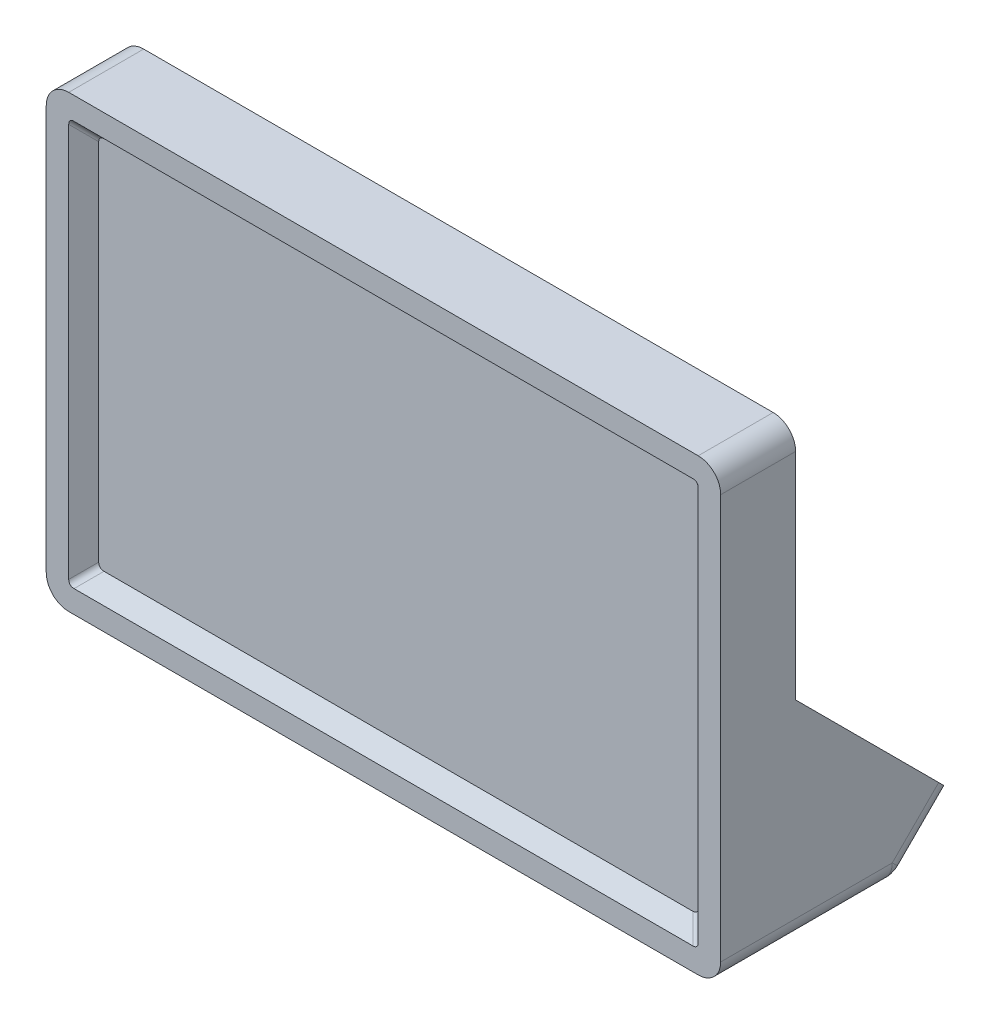
ISO-10303-21;
HEADER;
FILE_DESCRIPTION(('STEP AP214'),'2;1');
FILE_NAME('part.step','',(''),(''),'','','');
FILE_SCHEMA(('AUTOMOTIVE_DESIGN { 1 0 10303 214 1 1 1 1 }'));
ENDSEC;
DATA;
#1=APPLICATION_CONTEXT('core data for automotive mechanical design processes');
#2=APPLICATION_PROTOCOL_DEFINITION('international standard','automotive_design',2000,#1);
#3=PRODUCT_CONTEXT('',#1,'mechanical');
#4=PRODUCT('Part','Part','',(#3));
#5=PRODUCT_RELATED_PRODUCT_CATEGORY('part','',(#4));
#6=PRODUCT_DEFINITION_FORMATION('','',#4);
#7=PRODUCT_DEFINITION_CONTEXT('part definition',#1,'design');
#8=PRODUCT_DEFINITION('design','',#6,#7);
#9=PRODUCT_DEFINITION_SHAPE('','',#8);
#10=(LENGTH_UNIT() NAMED_UNIT(*) SI_UNIT(.MILLI.,.METRE.));
#11=(NAMED_UNIT(*) PLANE_ANGLE_UNIT() SI_UNIT($,.RADIAN.));
#12=(NAMED_UNIT(*) SI_UNIT($,.STERADIAN.) SOLID_ANGLE_UNIT());
#13=UNCERTAINTY_MEASURE_WITH_UNIT(LENGTH_MEASURE(1.E-05),#10,'distance_accuracy_value','');
#14=(GEOMETRIC_REPRESENTATION_CONTEXT(3) GLOBAL_UNCERTAINTY_ASSIGNED_CONTEXT((#13)) GLOBAL_UNIT_ASSIGNED_CONTEXT((#10,
#11,#12)) REPRESENTATION_CONTEXT('',''));
#15=CARTESIAN_POINT('',(0.,0.,0.));
#16=DIRECTION('',(0.,0.,1.));
#17=DIRECTION('',(1.,0.,0.));
#18=AXIS2_PLACEMENT_3D('',#15,#16,#17);
#19=CARTESIAN_POINT('',(0.,0.,0.));
#20=DIRECTION('',(0.,0.,-1.));
#21=DIRECTION('',(-1.,0.,0.));
#22=AXIS2_PLACEMENT_3D('',#19,#20,#21);
#23=PLANE('',#22);
#24=DIRECTION('',(-1.,0.,0.));
#25=VECTOR('',#24,1.);
#26=CARTESIAN_POINT('',(0.,60.,0.));
#27=LINE('',#26,#25);
#28=CARTESIAN_POINT('',(87.,60.,0.));
#29=VERTEX_POINT('',#28);
#30=CARTESIAN_POINT('',(3.,60.,0.));
#31=VERTEX_POINT('',#30);
#32=EDGE_CURVE('E201',#29,#31,#27,.T.);
#33=ORIENTED_EDGE('',*,*,#32,.F.);
#34=CARTESIAN_POINT('',(87.,57.,0.));
#35=DIRECTION('',(0.,0.,-1.));
#36=DIRECTION('',(-1.,0.,0.));
#37=AXIS2_PLACEMENT_3D('',#34,#35,#36);
#38=CIRCLE('',#37,3.);
#39=CARTESIAN_POINT('',(90.,57.,0.));
#40=VERTEX_POINT('',#39);
#41=EDGE_CURVE('E200',#29,#40,#38,.T.);
#42=ORIENTED_EDGE('',*,*,#41,.T.);
#43=DIRECTION('',(0.,1.,0.));
#44=VECTOR('',#43,1.);
#45=CARTESIAN_POINT('',(90.,0.,0.));
#46=LINE('',#45,#44);
#47=CARTESIAN_POINT('',(90.,28.284271247462,0.));
#48=VERTEX_POINT('',#47);
#49=EDGE_CURVE('E181',#48,#40,#46,.T.);
#50=ORIENTED_EDGE('',*,*,#49,.F.);
#51=DIRECTION('',(-1.,0.,0.));
#52=VECTOR('',#51,1.);
#53=CARTESIAN_POINT('',(90.,28.284271247462,0.));
#54=LINE('',#53,#52);
#55=CARTESIAN_POINT('',(0.,28.284271247462,0.));
#56=VERTEX_POINT('',#55);
#57=EDGE_CURVE('E192',#48,#56,#54,.T.);
#58=ORIENTED_EDGE('',*,*,#57,.T.);
#59=DIRECTION('',(0.,-1.,0.));
#60=VECTOR('',#59,1.);
#61=CARTESIAN_POINT('',(0.,0.,0.));
#62=LINE('',#61,#60);
#63=CARTESIAN_POINT('',(0.,57.,0.));
#64=VERTEX_POINT('',#63);
#65=EDGE_CURVE('E202',#64,#56,#62,.T.);
#66=ORIENTED_EDGE('',*,*,#65,.F.);
#67=CARTESIAN_POINT('',(3.,57.,0.));
#68=DIRECTION('',(0.,0.,-1.));
#69=DIRECTION('',(-1.,0.,0.));
#70=AXIS2_PLACEMENT_3D('',#67,#68,#69);
#71=CIRCLE('',#70,3.);
#72=EDGE_CURVE('E253',#64,#31,#71,.T.);
#73=ORIENTED_EDGE('',*,*,#72,.T.);
#74=EDGE_LOOP('',(#33,#42,#50,#58,#66,#73));
#75=FACE_BOUND('',#74,.T.);
#76=ADVANCED_FACE('F40',(#75),#23,.T.);
#77=CARTESIAN_POINT('',(0.,0.,10.));
#78=DIRECTION('',(0.,0.,-1.));
#79=DIRECTION('',(-1.,0.,0.));
#80=AXIS2_PLACEMENT_3D('',#77,#78,#79);
#81=PLANE('',#80);
#82=DIRECTION('',(-1.,0.,0.));
#83=VECTOR('',#82,1.);
#84=CARTESIAN_POINT('',(5.,3.,10.));
#85=LINE('',#84,#83);
#86=CARTESIAN_POINT('',(86.2928932188134,3.,10.));
#87=VERTEX_POINT('',#86);
#88=CARTESIAN_POINT('',(3.70710678118654,3.,10.));
#89=VERTEX_POINT('',#88);
#90=EDGE_CURVE('E213',#87,#89,#85,.T.);
#91=ORIENTED_EDGE('',*,*,#90,.T.);
#92=CARTESIAN_POINT('',(4.41421356237309,4.41421356237309,10.));
#93=DIRECTION('',(0.,0.,-1.));
#94=DIRECTION('',(-0.707106781186548,-0.707106781186548,0.));
#95=AXIS2_PLACEMENT_3D('',#92,#93,#94);
#96=ELLIPSE('',#95,1.73205080756888,1.);
#97=CARTESIAN_POINT('',(3.,3.70710678118655,10.));
#98=VERTEX_POINT('',#97);
#99=EDGE_CURVE('E311',#89,#98,#96,.T.);
#100=ORIENTED_EDGE('',*,*,#99,.T.);
#101=DIRECTION('',(0.,1.,0.));
#102=VECTOR('',#101,1.);
#103=CARTESIAN_POINT('',(3.,55.,10.));
#104=LINE('',#103,#102);
#105=CARTESIAN_POINT('',(3.,56.2928932188135,10.));
#106=VERTEX_POINT('',#105);
#107=EDGE_CURVE('E211',#98,#106,#104,.T.);
#108=ORIENTED_EDGE('',*,*,#107,.T.);
#109=CARTESIAN_POINT('',(4.41421356237309,55.5857864376269,10.));
#110=DIRECTION('',(0.,0.,-1.));
#111=DIRECTION('',(-0.707106781186548,0.707106781186548,0.));
#112=AXIS2_PLACEMENT_3D('',#109,#110,#111);
#113=ELLIPSE('',#112,1.73205080756888,1.);
#114=CARTESIAN_POINT('',(3.70710678118655,57.,10.));
#115=VERTEX_POINT('',#114);
#116=EDGE_CURVE('E11',#106,#115,#113,.T.);
#117=ORIENTED_EDGE('',*,*,#116,.T.);
#118=DIRECTION('',(1.,0.,0.));
#119=VECTOR('',#118,1.);
#120=CARTESIAN_POINT('',(85.,57.,10.));
#121=LINE('',#120,#119);
#122=CARTESIAN_POINT('',(86.2928932188134,57.,10.));
#123=VERTEX_POINT('',#122);
#124=EDGE_CURVE('E220',#115,#123,#121,.T.);
#125=ORIENTED_EDGE('',*,*,#124,.T.);
#126=CARTESIAN_POINT('',(85.5857864376269,55.5857864376269,10.));
#127=DIRECTION('',(0.,0.,-1.));
#128=DIRECTION('',(-0.707106781186548,-0.707106781186548,0.));
#129=AXIS2_PLACEMENT_3D('',#126,#127,#128);
#130=ELLIPSE('',#129,1.73205080756888,1.);
#131=CARTESIAN_POINT('',(87.,56.2928932188135,10.));
#132=VERTEX_POINT('',#131);
#133=EDGE_CURVE('E48',#123,#132,#130,.T.);
#134=ORIENTED_EDGE('',*,*,#133,.T.);
#135=DIRECTION('',(0.,-1.,0.));
#136=VECTOR('',#135,1.);
#137=CARTESIAN_POINT('',(87.,5.,10.));
#138=LINE('',#137,#136);
#139=CARTESIAN_POINT('',(87.,3.70710678118655,10.));
#140=VERTEX_POINT('',#139);
#141=EDGE_CURVE('E217',#132,#140,#138,.T.);
#142=ORIENTED_EDGE('',*,*,#141,.T.);
#143=CARTESIAN_POINT('',(85.5857864376269,4.41421356237309,10.));
#144=DIRECTION('',(0.,0.,-1.));
#145=DIRECTION('',(-0.707106781186548,0.707106781186548,0.));
#146=AXIS2_PLACEMENT_3D('',#143,#144,#145);
#147=ELLIPSE('',#146,1.73205080756888,1.);
#148=EDGE_CURVE('E313',#140,#87,#147,.T.);
#149=ORIENTED_EDGE('',*,*,#148,.T.);
#150=EDGE_LOOP('',(#91,#100,#108,#117,#125,#134,#142,#149));
#151=FACE_BOUND('',#150,.T.);
#152=DIRECTION('',(0.,1.,0.));
#153=VECTOR('',#152,1.);
#154=CARTESIAN_POINT('',(90.,0.,10.));
#155=LINE('',#154,#153);
#156=CARTESIAN_POINT('',(90.,3.,10.));
#157=VERTEX_POINT('',#156);
#158=CARTESIAN_POINT('',(90.,57.,10.));
#159=VERTEX_POINT('',#158);
#160=EDGE_CURVE('E343',#157,#159,#155,.T.);
#161=ORIENTED_EDGE('',*,*,#160,.T.);
#162=CARTESIAN_POINT('',(87.,57.,10.));
#163=DIRECTION('',(0.,0.,-1.));
#164=DIRECTION('',(-1.,0.,0.));
#165=AXIS2_PLACEMENT_3D('',#162,#163,#164);
#166=CIRCLE('',#165,3.);
#167=CARTESIAN_POINT('',(87.,60.,10.));
#168=VERTEX_POINT('',#167);
#169=EDGE_CURVE('E266',#159,#168,#166,.F.);
#170=ORIENTED_EDGE('',*,*,#169,.T.);
#171=DIRECTION('',(-1.,0.,0.));
#172=VECTOR('',#171,1.);
#173=CARTESIAN_POINT('',(0.,60.,10.));
#174=LINE('',#173,#172);
#175=CARTESIAN_POINT('',(3.,60.,10.));
#176=VERTEX_POINT('',#175);
#177=EDGE_CURVE('E214',#168,#176,#174,.T.);
#178=ORIENTED_EDGE('',*,*,#177,.T.);
#179=CARTESIAN_POINT('',(3.,57.,10.));
#180=DIRECTION('',(0.,0.,-1.));
#181=DIRECTION('',(-1.,0.,0.));
#182=AXIS2_PLACEMENT_3D('',#179,#180,#181);
#183=CIRCLE('',#182,3.);
#184=CARTESIAN_POINT('',(0.,57.,10.));
#185=VERTEX_POINT('',#184);
#186=EDGE_CURVE('E260',#176,#185,#183,.F.);
#187=ORIENTED_EDGE('',*,*,#186,.T.);
#188=DIRECTION('',(0.,-1.,0.));
#189=VECTOR('',#188,1.);
#190=CARTESIAN_POINT('',(0.,0.,10.));
#191=LINE('',#190,#189);
#192=CARTESIAN_POINT('',(0.,3.,10.));
#193=VERTEX_POINT('',#192);
#194=EDGE_CURVE('E205',#185,#193,#191,.T.);
#195=ORIENTED_EDGE('',*,*,#194,.T.);
#196=CARTESIAN_POINT('',(3.,3.,10.));
#197=DIRECTION('',(0.,0.,-1.));
#198=DIRECTION('',(-1.,0.,0.));
#199=AXIS2_PLACEMENT_3D('',#196,#197,#198);
#200=CIRCLE('',#199,3.);
#201=CARTESIAN_POINT('',(3.,0.,10.));
#202=VERTEX_POINT('',#201);
#203=EDGE_CURVE('E262',#193,#202,#200,.F.);
#204=ORIENTED_EDGE('',*,*,#203,.T.);
#205=DIRECTION('',(1.,0.,0.));
#206=VECTOR('',#205,1.);
#207=CARTESIAN_POINT('',(0.,0.,10.));
#208=LINE('',#207,#206);
#209=CARTESIAN_POINT('',(87.,0.,10.));
#210=VERTEX_POINT('',#209);
#211=EDGE_CURVE('E340',#202,#210,#208,.T.);
#212=ORIENTED_EDGE('',*,*,#211,.T.);
#213=CARTESIAN_POINT('',(87.,3.,10.));
#214=DIRECTION('',(0.,0.,-1.));
#215=DIRECTION('',(-1.,0.,0.));
#216=AXIS2_PLACEMENT_3D('',#213,#214,#215);
#217=CIRCLE('',#216,3.);
#218=EDGE_CURVE('E264',#210,#157,#217,.F.);
#219=ORIENTED_EDGE('',*,*,#218,.T.);
#220=EDGE_LOOP('',(#161,#170,#178,#187,#195,#204,#212,#219));
#221=FACE_BOUND('',#220,.T.);
#222=ADVANCED_FACE('F315',(#151,#221),#81,.F.);
#223=CARTESIAN_POINT('',(0.,0.,10.));
#224=DIRECTION('',(1.,0.,0.));
#225=DIRECTION('',(0.,0.,-1.));
#226=AXIS2_PLACEMENT_3D('',#223,#224,#225);
#227=PLANE('',#226);
#228=DIRECTION('',(0.,0.707106781186544,-0.707106781186552));
#229=VECTOR('',#228,1.);
#230=CARTESIAN_POINT('',(0.,-9.94974746830575,0.0502525316943662));
#231=LINE('',#230,#229);
#232=CARTESIAN_POINT('',(0.,9.19238815542509,-19.0918830920367));
#233=VERTEX_POINT('',#232);
#234=CARTESIAN_POINT('',(0.,3.,-12.8994949366115));
#235=VERTEX_POINT('',#234);
#236=EDGE_CURVE('E232',#233,#235,#231,.F.);
#237=ORIENTED_EDGE('',*,*,#236,.T.);
#238=DIRECTION('',(0.,0.,-1.));
#239=VECTOR('',#238,1.);
#240=CARTESIAN_POINT('',(0.,3.,10.));
#241=LINE('',#240,#239);
#242=EDGE_CURVE('E271',#235,#193,#241,.F.);
#243=ORIENTED_EDGE('',*,*,#242,.T.);
#244=ORIENTED_EDGE('',*,*,#194,.F.);
#245=DIRECTION('',(0.,0.,-1.));
#246=VECTOR('',#245,1.);
#247=CARTESIAN_POINT('',(0.,57.,10.));
#248=LINE('',#247,#246);
#249=EDGE_CURVE('E268',#185,#64,#248,.T.);
#250=ORIENTED_EDGE('',*,*,#249,.T.);
#251=ORIENTED_EDGE('',*,*,#65,.T.);
#252=DIRECTION('',(0.,0.707106781186551,0.707106781186544));
#253=VECTOR('',#252,1.);
#254=CARTESIAN_POINT('',(0.,7.07106781186543,-21.2132034355963));
#255=LINE('',#254,#253);
#256=EDGE_CURVE('E188',#233,#56,#255,.T.);
#257=ORIENTED_EDGE('',*,*,#256,.F.);
#258=EDGE_LOOP('',(#237,#243,#244,#250,#251,#257));
#259=FACE_BOUND('',#258,.T.);
#260=ADVANCED_FACE('F357',(#259),#227,.F.);
#261=CARTESIAN_POINT('',(0.,0.,10.));
#262=DIRECTION('',(0.,1.,0.));
#263=DIRECTION('',(0.,0.,1.));
#264=AXIS2_PLACEMENT_3D('',#261,#262,#263);
#265=PLANE('',#264);
#266=DIRECTION('',(-1.,0.,0.));
#267=VECTOR('',#266,1.);
#268=CARTESIAN_POINT('',(0.,0.,-12.8994949366115));
#269=LINE('',#268,#267);
#270=CARTESIAN_POINT('',(3.,0.,-12.8994949366115));
#271=VERTEX_POINT('',#270);
#272=CARTESIAN_POINT('',(87.,0.,-12.8994949366115));
#273=VERTEX_POINT('',#272);
#274=EDGE_CURVE('E242',#271,#273,#269,.F.);
#275=ORIENTED_EDGE('',*,*,#274,.T.);
#276=DIRECTION('',(0.,0.,-1.));
#277=VECTOR('',#276,1.);
#278=CARTESIAN_POINT('',(87.,0.,10.));
#279=LINE('',#278,#277);
#280=EDGE_CURVE('E244',#273,#210,#279,.F.);
#281=ORIENTED_EDGE('',*,*,#280,.T.);
#282=ORIENTED_EDGE('',*,*,#211,.F.);
#283=DIRECTION('',(0.,0.,-1.));
#284=VECTOR('',#283,1.);
#285=CARTESIAN_POINT('',(3.,0.,10.));
#286=LINE('',#285,#284);
#287=EDGE_CURVE('E240',#202,#271,#286,.T.);
#288=ORIENTED_EDGE('',*,*,#287,.T.);
#289=EDGE_LOOP('',(#275,#281,#282,#288));
#290=FACE_BOUND('',#289,.T.);
#291=ADVANCED_FACE('F400',(#290),#265,.F.);
#292=CARTESIAN_POINT('',(90.,0.,10.));
#293=DIRECTION('',(-1.,0.,0.));
#294=DIRECTION('',(0.,0.,1.));
#295=AXIS2_PLACEMENT_3D('',#292,#293,#294);
#296=PLANE('',#295);
#297=ORIENTED_EDGE('',*,*,#49,.T.);
#298=DIRECTION('',(0.,0.,-1.));
#299=VECTOR('',#298,1.);
#300=CARTESIAN_POINT('',(90.,57.,10.));
#301=LINE('',#300,#299);
#302=EDGE_CURVE('E258',#40,#159,#301,.F.);
#303=ORIENTED_EDGE('',*,*,#302,.T.);
#304=ORIENTED_EDGE('',*,*,#160,.F.);
#305=DIRECTION('',(0.,0.,-1.));
#306=VECTOR('',#305,1.);
#307=CARTESIAN_POINT('',(90.,3.,10.));
#308=LINE('',#307,#306);
#309=CARTESIAN_POINT('',(90.,3.,-12.8994949366115));
#310=VERTEX_POINT('',#309);
#311=EDGE_CURVE('E256',#157,#310,#308,.T.);
#312=ORIENTED_EDGE('',*,*,#311,.T.);
#313=DIRECTION('',(0.,0.707106781186544,-0.707106781186552));
#314=VECTOR('',#313,1.);
#315=CARTESIAN_POINT('',(90.,-9.94974746830575,0.0502525316943645));
#316=LINE('',#315,#314);
#317=CARTESIAN_POINT('',(90.,9.19238815542508,-19.0918830920367));
#318=VERTEX_POINT('',#317);
#319=EDGE_CURVE('E184',#310,#318,#316,.T.);
#320=ORIENTED_EDGE('',*,*,#319,.T.);
#321=DIRECTION('',(0.,0.707106781186551,0.707106781186544));
#322=VECTOR('',#321,1.);
#323=CARTESIAN_POINT('',(90.,7.07106781186543,-21.2132034355963));
#324=LINE('',#323,#322);
#325=EDGE_CURVE('E177',#318,#48,#324,.T.);
#326=ORIENTED_EDGE('',*,*,#325,.T.);
#327=EDGE_LOOP('',(#297,#303,#304,#312,#320,#326));
#328=FACE_BOUND('',#327,.T.);
#329=ADVANCED_FACE('F179',(#328),#296,.F.);
#330=CARTESIAN_POINT('',(0.,60.,10.));
#331=DIRECTION('',(0.,-1.,0.));
#332=DIRECTION('',(0.,0.,-1.));
#333=AXIS2_PLACEMENT_3D('',#330,#331,#332);
#334=PLANE('',#333);
#335=ORIENTED_EDGE('',*,*,#177,.F.);
#336=DIRECTION('',(0.,0.,-1.));
#337=VECTOR('',#336,1.);
#338=CARTESIAN_POINT('',(87.,60.,10.));
#339=LINE('',#338,#337);
#340=EDGE_CURVE('E250',#168,#29,#339,.T.);
#341=ORIENTED_EDGE('',*,*,#340,.T.);
#342=ORIENTED_EDGE('',*,*,#32,.T.);
#343=DIRECTION('',(0.,0.,-1.));
#344=VECTOR('',#343,1.);
#345=CARTESIAN_POINT('',(3.,60.,10.));
#346=LINE('',#345,#344);
#347=EDGE_CURVE('E248',#31,#176,#346,.F.);
#348=ORIENTED_EDGE('',*,*,#347,.T.);
#349=EDGE_LOOP('',(#335,#341,#342,#348));
#350=FACE_BOUND('',#349,.T.);
#351=ADVANCED_FACE('F358',(#350),#334,.F.);
#352=CARTESIAN_POINT('',(0.,0.,8.));
#353=DIRECTION('',(0.,0.,1.));
#354=DIRECTION('',(1.,0.,0.));
#355=AXIS2_PLACEMENT_3D('',#352,#353,#354);
#356=PLANE('',#355);
#357=DIRECTION('',(0.,1.,0.));
#358=VECTOR('',#357,1.);
#359=CARTESIAN_POINT('',(5.,0.,8.));
#360=LINE('',#359,#358);
#361=CARTESIAN_POINT('',(5.,5.70710678118655,8.));
#362=VERTEX_POINT('',#361);
#363=CARTESIAN_POINT('',(5.,54.2928932188135,8.));
#364=VERTEX_POINT('',#363);
#365=EDGE_CURVE('E197',#362,#364,#360,.T.);
#366=ORIENTED_EDGE('',*,*,#365,.F.);
#367=CARTESIAN_POINT('',(6.41421356237309,6.41421356237309,8.));
#368=DIRECTION('',(0.,0.,1.));
#369=DIRECTION('',(-0.707106781186548,-0.707106781186548,0.));
#370=AXIS2_PLACEMENT_3D('',#367,#368,#369);
#371=ELLIPSE('',#370,1.73205080756888,1.);
#372=CARTESIAN_POINT('',(5.70710678118655,5.,8.));
#373=VERTEX_POINT('',#372);
#374=EDGE_CURVE('E295',#362,#373,#371,.T.);
#375=ORIENTED_EDGE('',*,*,#374,.T.);
#376=DIRECTION('',(1.,0.,0.));
#377=VECTOR('',#376,1.);
#378=CARTESIAN_POINT('',(0.,5.,8.));
#379=LINE('',#378,#377);
#380=CARTESIAN_POINT('',(84.2928932188134,5.,8.));
#381=VERTEX_POINT('',#380);
#382=EDGE_CURVE('E334',#373,#381,#379,.T.);
#383=ORIENTED_EDGE('',*,*,#382,.T.);
#384=CARTESIAN_POINT('',(83.5857864376269,6.41421356237309,8.));
#385=DIRECTION('',(0.,0.,1.));
#386=DIRECTION('',(-0.707106781186548,0.707106781186548,0.));
#387=AXIS2_PLACEMENT_3D('',#384,#385,#386);
#388=ELLIPSE('',#387,1.73205080756888,1.);
#389=CARTESIAN_POINT('',(85.,5.70710678118655,8.));
#390=VERTEX_POINT('',#389);
#391=EDGE_CURVE('E293',#381,#390,#388,.T.);
#392=ORIENTED_EDGE('',*,*,#391,.T.);
#393=DIRECTION('',(0.,1.,0.));
#394=VECTOR('',#393,1.);
#395=CARTESIAN_POINT('',(85.,0.,8.));
#396=LINE('',#395,#394);
#397=CARTESIAN_POINT('',(85.,54.2928932188135,8.));
#398=VERTEX_POINT('',#397);
#399=EDGE_CURVE('E329',#390,#398,#396,.T.);
#400=ORIENTED_EDGE('',*,*,#399,.T.);
#401=CARTESIAN_POINT('',(83.5857864376269,53.5857864376269,8.));
#402=DIRECTION('',(0.,0.,1.));
#403=DIRECTION('',(-0.707106781186548,-0.707106781186548,0.));
#404=AXIS2_PLACEMENT_3D('',#401,#402,#403);
#405=ELLIPSE('',#404,1.73205080756888,1.);
#406=CARTESIAN_POINT('',(84.2928932188134,55.,8.));
#407=VERTEX_POINT('',#406);
#408=EDGE_CURVE('E291',#398,#407,#405,.T.);
#409=ORIENTED_EDGE('',*,*,#408,.T.);
#410=DIRECTION('',(1.,0.,0.));
#411=VECTOR('',#410,1.);
#412=CARTESIAN_POINT('',(0.,55.,8.));
#413=LINE('',#412,#411);
#414=CARTESIAN_POINT('',(5.70710678118655,55.,8.));
#415=VERTEX_POINT('',#414);
#416=EDGE_CURVE('E207',#415,#407,#413,.T.);
#417=ORIENTED_EDGE('',*,*,#416,.F.);
#418=CARTESIAN_POINT('',(6.41421356237309,53.5857864376269,8.));
#419=DIRECTION('',(0.,0.,1.));
#420=DIRECTION('',(-0.707106781186548,0.707106781186548,0.));
#421=AXIS2_PLACEMENT_3D('',#418,#419,#420);
#422=ELLIPSE('',#421,1.73205080756888,1.);
#423=EDGE_CURVE('E289',#415,#364,#422,.T.);
#424=ORIENTED_EDGE('',*,*,#423,.T.);
#425=EDGE_LOOP('',(#366,#375,#383,#392,#400,#409,#417,#424));
#426=FACE_BOUND('',#425,.T.);
#427=ADVANCED_FACE('F328',(#426),#356,.T.);
#428=CARTESIAN_POINT('',(5.,5.,8.));
#429=DIRECTION('',(0.,0.707106781186547,0.707106781186547));
#430=DIRECTION('',(-1.,0.,0.));
#431=AXIS2_PLACEMENT_3D('',#428,#429,#430);
#432=PLANE('',#431);
#433=ORIENTED_EDGE('',*,*,#382,.F.);
#434=DIRECTION('',(0.577350269189626,0.577350269189626,-0.577350269189626));
#435=VECTOR('',#434,1.);
#436=CARTESIAN_POINT('',(3.47140452079103,2.76429773960448,10.2357022603955));
#437=LINE('',#436,#435);
#438=EDGE_CURVE('E299',#373,#89,#437,.F.);
#439=ORIENTED_EDGE('',*,*,#438,.T.);
#440=ORIENTED_EDGE('',*,*,#90,.F.);
#441=DIRECTION('',(0.577350269189626,-0.577350269189626,0.577350269189626));
#442=VECTOR('',#441,1.);
#443=CARTESIAN_POINT('',(84.528595479209,4.76429773960449,8.23570226039551));
#444=LINE('',#443,#442);
#445=EDGE_CURVE('E297',#87,#381,#444,.F.);
#446=ORIENTED_EDGE('',*,*,#445,.T.);
#447=EDGE_LOOP('',(#433,#439,#440,#446));
#448=FACE_BOUND('',#447,.T.);
#449=ADVANCED_FACE('F421',(#448),#432,.T.);
#450=CARTESIAN_POINT('',(85.,5.,8.));
#451=DIRECTION('',(-0.707106781186547,0.,0.707106781186547));
#452=DIRECTION('',(0.,-1.,0.));
#453=AXIS2_PLACEMENT_3D('',#450,#451,#452);
#454=PLANE('',#453);
#455=ORIENTED_EDGE('',*,*,#399,.F.);
#456=DIRECTION('',(0.577350269189626,-0.577350269189626,0.577350269189626));
#457=VECTOR('',#456,1.);
#458=CARTESIAN_POINT('',(87.2357022603955,3.47140452079103,10.2357022603955));
#459=LINE('',#458,#457);
#460=EDGE_CURVE('E303',#390,#140,#459,.T.);
#461=ORIENTED_EDGE('',*,*,#460,.T.);
#462=ORIENTED_EDGE('',*,*,#141,.F.);
#463=DIRECTION('',(0.577350269189626,0.577350269189626,0.577350269189626));
#464=VECTOR('',#463,1.);
#465=CARTESIAN_POINT('',(85.2357022603955,54.528595479209,8.23570226039551));
#466=LINE('',#465,#464);
#467=EDGE_CURVE('E301',#132,#398,#466,.F.);
#468=ORIENTED_EDGE('',*,*,#467,.T.);
#469=EDGE_LOOP('',(#455,#461,#462,#468));
#470=FACE_BOUND('',#469,.T.);
#471=ADVANCED_FACE('F319',(#470),#454,.T.);
#472=CARTESIAN_POINT('',(5.,5.,8.));
#473=DIRECTION('',(0.707106781186547,0.,0.707106781186547));
#474=DIRECTION('',(0.,1.,0.));
#475=AXIS2_PLACEMENT_3D('',#472,#473,#474);
#476=PLANE('',#475);
#477=ORIENTED_EDGE('',*,*,#107,.F.);
#478=DIRECTION('',(0.577350269189626,0.577350269189626,-0.577350269189626));
#479=VECTOR('',#478,1.);
#480=CARTESIAN_POINT('',(4.76429773960448,5.47140452079103,8.23570226039551));
#481=LINE('',#480,#479);
#482=EDGE_CURVE('E286',#98,#362,#481,.T.);
#483=ORIENTED_EDGE('',*,*,#482,.T.);
#484=ORIENTED_EDGE('',*,*,#365,.T.);
#485=DIRECTION('',(0.577350269189626,-0.577350269189626,-0.577350269189626));
#486=VECTOR('',#485,1.);
#487=CARTESIAN_POINT('',(2.76429773960448,56.528595479209,10.2357022603955));
#488=LINE('',#487,#486);
#489=EDGE_CURVE('E273',#364,#106,#488,.F.);
#490=ORIENTED_EDGE('',*,*,#489,.T.);
#491=EDGE_LOOP('',(#477,#483,#484,#490));
#492=FACE_BOUND('',#491,.T.);
#493=ADVANCED_FACE('F473',(#492),#476,.T.);
#494=CARTESIAN_POINT('',(5.,55.,8.));
#495=DIRECTION('',(0.,-0.707106781186547,0.707106781186547));
#496=DIRECTION('',(1.,0.,0.));
#497=AXIS2_PLACEMENT_3D('',#494,#495,#496);
#498=PLANE('',#497);
#499=ORIENTED_EDGE('',*,*,#416,.T.);
#500=DIRECTION('',(0.577350269189626,0.577350269189626,0.577350269189626));
#501=VECTOR('',#500,1.);
#502=CARTESIAN_POINT('',(86.5285954792089,57.2357022603955,10.2357022603955));
#503=LINE('',#502,#501);
#504=EDGE_CURVE('E309',#407,#123,#503,.T.);
#505=ORIENTED_EDGE('',*,*,#504,.T.);
#506=ORIENTED_EDGE('',*,*,#124,.F.);
#507=DIRECTION('',(0.577350269189626,-0.577350269189626,-0.577350269189626));
#508=VECTOR('',#507,1.);
#509=CARTESIAN_POINT('',(5.47140452079103,55.2357022603955,8.23570226039551));
#510=LINE('',#509,#508);
#511=EDGE_CURVE('E306',#115,#415,#510,.T.);
#512=ORIENTED_EDGE('',*,*,#511,.T.);
#513=EDGE_LOOP('',(#499,#505,#506,#512));
#514=FACE_BOUND('',#513,.T.);
#515=ADVANCED_FACE('F331',(#514),#498,.T.);
#516=CARTESIAN_POINT('',(90.,7.07106781186543,-21.2132034355963));
#517=DIRECTION('',(0.,-0.707106781186544,0.707106781186551));
#518=DIRECTION('',(0.,-0.707106781186551,-0.707106781186544));
#519=AXIS2_PLACEMENT_3D('',#516,#517,#518);
#520=PLANE('',#519);
#521=ORIENTED_EDGE('',*,*,#325,.F.);
#522=CARTESIAN_POINT('',(87.,9.19238815542509,-19.0918830920367));
#523=DIRECTION('',(0.,-0.707106781186544,0.707106781186551));
#524=DIRECTION('',(0.,-0.707106781186551,-0.707106781186544));
#525=AXIS2_PLACEMENT_3D('',#522,#523,#524);
#526=CIRCLE('',#525,3.);
#527=CARTESIAN_POINT('',(87.,7.07106781186543,-21.2132034355963));
#528=VERTEX_POINT('',#527);
#529=EDGE_CURVE('E225',#318,#528,#526,.F.);
#530=ORIENTED_EDGE('',*,*,#529,.T.);
#531=DIRECTION('',(-1.,0.,0.));
#532=VECTOR('',#531,1.);
#533=CARTESIAN_POINT('',(90.,7.07106781186543,-21.2132034355963));
#534=LINE('',#533,#532);
#535=CARTESIAN_POINT('',(3.00000000000003,7.07106781186543,-21.2132034355963));
#536=VERTEX_POINT('',#535);
#537=EDGE_CURVE('E187',#528,#536,#534,.T.);
#538=ORIENTED_EDGE('',*,*,#537,.T.);
#539=CARTESIAN_POINT('',(3.,9.19238815542509,-19.0918830920367));
#540=DIRECTION('',(0.,-0.707106781186544,0.707106781186551));
#541=DIRECTION('',(0.,-0.707106781186551,-0.707106781186544));
#542=AXIS2_PLACEMENT_3D('',#539,#540,#541);
#543=CIRCLE('',#542,3.);
#544=EDGE_CURVE('E223',#536,#233,#543,.F.);
#545=ORIENTED_EDGE('',*,*,#544,.T.);
#546=ORIENTED_EDGE('',*,*,#256,.T.);
#547=ORIENTED_EDGE('',*,*,#57,.F.);
#548=EDGE_LOOP('',(#521,#530,#538,#545,#546,#547));
#549=FACE_BOUND('',#548,.T.);
#550=ADVANCED_FACE('F193',(#549),#520,.F.);
#551=CARTESIAN_POINT('',(90.,0.,-14.1421356237308));
#552=DIRECTION('',(0.,0.707106781186551,0.707106781186543));
#553=DIRECTION('',(0.,-0.707106781186544,0.707106781186552));
#554=AXIS2_PLACEMENT_3D('',#551,#552,#553);
#555=PLANE('',#554);
#556=DIRECTION('',(0.,0.707106781186544,-0.707106781186552));
#557=VECTOR('',#556,1.);
#558=CARTESIAN_POINT('',(87.,0.,-14.1421356237308));
#559=LINE('',#558,#557);
#560=CARTESIAN_POINT('',(87.,0.878679656440346,-15.0208152801712));
#561=VERTEX_POINT('',#560);
#562=EDGE_CURVE('E229',#528,#561,#559,.F.);
#563=ORIENTED_EDGE('',*,*,#562,.T.);
#564=DIRECTION('',(-1.,0.,0.));
#565=VECTOR('',#564,1.);
#566=CARTESIAN_POINT('',(90.,0.878679656440346,-15.0208152801712));
#567=LINE('',#566,#565);
#568=CARTESIAN_POINT('',(3.,0.878679656440346,-15.0208152801712));
#569=VERTEX_POINT('',#568);
#570=EDGE_CURVE('E238',#561,#569,#567,.T.);
#571=ORIENTED_EDGE('',*,*,#570,.T.);
#572=DIRECTION('',(0.,0.707106781186544,-0.707106781186552));
#573=VECTOR('',#572,1.);
#574=CARTESIAN_POINT('',(3.,0.,-14.1421356237308));
#575=LINE('',#574,#573);
#576=EDGE_CURVE('E227',#569,#536,#575,.T.);
#577=ORIENTED_EDGE('',*,*,#576,.T.);
#578=ORIENTED_EDGE('',*,*,#537,.F.);
#579=EDGE_LOOP('',(#563,#571,#577,#578));
#580=FACE_BOUND('',#579,.T.);
#581=ADVANCED_FACE('F383',(#580),#555,.F.);
#582=CARTESIAN_POINT('',(87.,-9.94974746830575,0.0502525316943662));
#583=DIRECTION('',(0.,0.707106781186544,-0.707106781186552));
#584=DIRECTION('',(0.,0.707106781186552,0.707106781186544));
#585=AXIS2_PLACEMENT_3D('',#582,#583,#584);
#586=CYLINDRICAL_SURFACE('',#585,3.);
#587=ORIENTED_EDGE('',*,*,#319,.F.);
#588=CARTESIAN_POINT('',(87.,3.,-12.8994949366115));
#589=DIRECTION('',(0.,0.707106781186544,-0.707106781186552));
#590=DIRECTION('',(0.,0.707106781186552,0.707106781186544));
#591=AXIS2_PLACEMENT_3D('',#588,#589,#590);
#592=CIRCLE('',#591,3.);
#593=EDGE_CURVE('E235',#310,#561,#592,.T.);
#594=ORIENTED_EDGE('',*,*,#593,.T.);
#595=ORIENTED_EDGE('',*,*,#562,.F.);
#596=ORIENTED_EDGE('',*,*,#529,.F.);
#597=EDGE_LOOP('',(#587,#594,#595,#596));
#598=FACE_BOUND('',#597,.T.);
#599=ADVANCED_FACE('F372',(#598),#586,.T.);
#600=CARTESIAN_POINT('',(3.,2.12132034355965,-12.0208152801712));
#601=DIRECTION('',(0.,0.707106781186544,-0.707106781186552));
#602=DIRECTION('',(0.,0.707106781186552,0.707106781186544));
#603=AXIS2_PLACEMENT_3D('',#600,#601,#602);
#604=CYLINDRICAL_SURFACE('',#603,3.);
#605=ORIENTED_EDGE('',*,*,#576,.F.);
#606=CARTESIAN_POINT('',(3.,3.,-12.8994949366115));
#607=DIRECTION('',(0.,0.707106781186544,-0.707106781186552));
#608=DIRECTION('',(0.,0.707106781186552,0.707106781186544));
#609=AXIS2_PLACEMENT_3D('',#606,#607,#608);
#610=CIRCLE('',#609,3.);
#611=EDGE_CURVE('E246',#569,#235,#610,.T.);
#612=ORIENTED_EDGE('',*,*,#611,.T.);
#613=ORIENTED_EDGE('',*,*,#236,.F.);
#614=ORIENTED_EDGE('',*,*,#544,.F.);
#615=EDGE_LOOP('',(#605,#612,#613,#614));
#616=FACE_BOUND('',#615,.T.);
#617=ADVANCED_FACE('F388',(#616),#604,.T.);
#618=CARTESIAN_POINT('',(3.,3.,10.));
#619=DIRECTION('',(0.,0.,-1.));
#620=DIRECTION('',(-1.,0.,0.));
#621=AXIS2_PLACEMENT_3D('',#618,#619,#620);
#622=CYLINDRICAL_SURFACE('',#621,3.);
#623=ORIENTED_EDGE('',*,*,#203,.F.);
#624=ORIENTED_EDGE('',*,*,#242,.F.);
#625=CARTESIAN_POINT('',(3.,3.,-12.8994949366115));
#626=DIRECTION('',(0.,0.,-1.));
#627=DIRECTION('',(-1.,0.,0.));
#628=AXIS2_PLACEMENT_3D('',#625,#626,#627);
#629=CIRCLE('',#628,3.);
#630=EDGE_CURVE('E282',#271,#235,#629,.T.);
#631=ORIENTED_EDGE('',*,*,#630,.F.);
#632=ORIENTED_EDGE('',*,*,#287,.F.);
#633=EDGE_LOOP('',(#623,#624,#631,#632));
#634=FACE_BOUND('',#633,.T.);
#635=ADVANCED_FACE('F398',(#634),#622,.T.);
#636=CARTESIAN_POINT('',(3.,3.,-12.8994949366115));
#637=DIRECTION('',(0.,1.,0.));
#638=DIRECTION('',(0.,0.,1.));
#639=AXIS2_PLACEMENT_3D('',#636,#637,#638);
#640=SPHERICAL_SURFACE('',#639,3.);
#641=ORIENTED_EDGE('',*,*,#630,.T.);
#642=ORIENTED_EDGE('',*,*,#611,.F.);
#643=CARTESIAN_POINT('',(3.,3.,-12.8994949366115));
#644=DIRECTION('',(1.,0.,0.));
#645=DIRECTION('',(0.,0.,-1.));
#646=AXIS2_PLACEMENT_3D('',#643,#644,#645);
#647=CIRCLE('',#646,3.);
#648=EDGE_CURVE('E279',#271,#569,#647,.T.);
#649=ORIENTED_EDGE('',*,*,#648,.F.);
#650=EDGE_LOOP('',(#641,#642,#649));
#651=FACE_BOUND('',#650,.T.);
#652=ADVANCED_FACE('F392',(#651),#640,.T.);
#653=CARTESIAN_POINT('',(90.,3.,-12.8994949366115));
#654=DIRECTION('',(-1.,0.,0.));
#655=DIRECTION('',(0.,0.,1.));
#656=AXIS2_PLACEMENT_3D('',#653,#654,#655);
#657=CYLINDRICAL_SURFACE('',#656,3.);
#658=ORIENTED_EDGE('',*,*,#648,.T.);
#659=ORIENTED_EDGE('',*,*,#570,.F.);
#660=CARTESIAN_POINT('',(87.,3.,-12.8994949366115));
#661=DIRECTION('',(1.,0.,0.));
#662=DIRECTION('',(0.,0.,-1.));
#663=AXIS2_PLACEMENT_3D('',#660,#661,#662);
#664=CIRCLE('',#663,3.);
#665=EDGE_CURVE('E277',#273,#561,#664,.T.);
#666=ORIENTED_EDGE('',*,*,#665,.F.);
#667=ORIENTED_EDGE('',*,*,#274,.F.);
#668=EDGE_LOOP('',(#658,#659,#666,#667));
#669=FACE_BOUND('',#668,.T.);
#670=ADVANCED_FACE('F379',(#669),#657,.T.);
#671=CARTESIAN_POINT('',(87.,3.,10.));
#672=DIRECTION('',(0.,0.,-1.));
#673=DIRECTION('',(-1.,0.,0.));
#674=AXIS2_PLACEMENT_3D('',#671,#672,#673);
#675=CYLINDRICAL_SURFACE('',#674,3.);
#676=ORIENTED_EDGE('',*,*,#218,.F.);
#677=ORIENTED_EDGE('',*,*,#280,.F.);
#678=CARTESIAN_POINT('',(87.,3.,-12.8994949366115));
#679=DIRECTION('',(0.,0.,-1.));
#680=DIRECTION('',(-1.,0.,0.));
#681=AXIS2_PLACEMENT_3D('',#678,#679,#680);
#682=CIRCLE('',#681,3.);
#683=EDGE_CURVE('E274',#310,#273,#682,.T.);
#684=ORIENTED_EDGE('',*,*,#683,.F.);
#685=ORIENTED_EDGE('',*,*,#311,.F.);
#686=EDGE_LOOP('',(#676,#677,#684,#685));
#687=FACE_BOUND('',#686,.T.);
#688=ADVANCED_FACE('F367',(#687),#675,.T.);
#689=CARTESIAN_POINT('',(87.,3.,-12.8994949366115));
#690=DIRECTION('',(0.,1.,0.));
#691=DIRECTION('',(0.,0.,1.));
#692=AXIS2_PLACEMENT_3D('',#689,#690,#691);
#693=SPHERICAL_SURFACE('',#692,3.);
#694=ORIENTED_EDGE('',*,*,#665,.T.);
#695=ORIENTED_EDGE('',*,*,#593,.F.);
#696=ORIENTED_EDGE('',*,*,#683,.T.);
#697=EDGE_LOOP('',(#694,#695,#696));
#698=FACE_BOUND('',#697,.T.);
#699=ADVANCED_FACE('F375',(#698),#693,.T.);
#700=CARTESIAN_POINT('',(87.,57.,10.));
#701=DIRECTION('',(0.,0.,-1.));
#702=DIRECTION('',(-1.,0.,0.));
#703=AXIS2_PLACEMENT_3D('',#700,#701,#702);
#704=CYLINDRICAL_SURFACE('',#703,3.);
#705=ORIENTED_EDGE('',*,*,#169,.F.);
#706=ORIENTED_EDGE('',*,*,#302,.F.);
#707=ORIENTED_EDGE('',*,*,#41,.F.);
#708=ORIENTED_EDGE('',*,*,#340,.F.);
#709=EDGE_LOOP('',(#705,#706,#707,#708));
#710=FACE_BOUND('',#709,.T.);
#711=ADVANCED_FACE('F360',(#710),#704,.T.);
#712=CARTESIAN_POINT('',(3.,57.,10.));
#713=DIRECTION('',(0.,0.,-1.));
#714=DIRECTION('',(-1.,0.,0.));
#715=AXIS2_PLACEMENT_3D('',#712,#713,#714);
#716=CYLINDRICAL_SURFACE('',#715,3.);
#717=ORIENTED_EDGE('',*,*,#186,.F.);
#718=ORIENTED_EDGE('',*,*,#347,.F.);
#719=ORIENTED_EDGE('',*,*,#72,.F.);
#720=ORIENTED_EDGE('',*,*,#249,.F.);
#721=EDGE_LOOP('',(#717,#718,#719,#720));
#722=FACE_BOUND('',#721,.T.);
#723=ADVANCED_FACE('F355',(#722),#716,.T.);
#724=CARTESIAN_POINT('',(5.47140452079103,5.47140452079103,8.94280904158206));
#725=DIRECTION('',(-0.577350269189626,-0.577350269189626,0.577350269189626));
#726=DIRECTION('',(0.707106781186547,0.,0.707106781186547));
#727=AXIS2_PLACEMENT_3D('',#724,#725,#726);
#728=CYLINDRICAL_SURFACE('',#727,1.);
#729=ORIENTED_EDGE('',*,*,#99,.F.);
#730=ORIENTED_EDGE('',*,*,#438,.F.);
#731=ORIENTED_EDGE('',*,*,#374,.F.);
#732=ORIENTED_EDGE('',*,*,#482,.F.);
#733=EDGE_LOOP('',(#729,#730,#731,#732));
#734=FACE_BOUND('',#733,.T.);
#735=ADVANCED_FACE('F455',(#734),#728,.F.);
#736=CARTESIAN_POINT('',(84.528595479209,5.47140452079103,8.94280904158206));
#737=DIRECTION('',(-0.577350269189626,0.577350269189626,-0.577350269189626));
#738=DIRECTION('',(-0.707106781186547,0.,0.707106781186547));
#739=AXIS2_PLACEMENT_3D('',#736,#737,#738);
#740=CYLINDRICAL_SURFACE('',#739,1.);
#741=ORIENTED_EDGE('',*,*,#391,.F.);
#742=ORIENTED_EDGE('',*,*,#445,.F.);
#743=ORIENTED_EDGE('',*,*,#148,.F.);
#744=ORIENTED_EDGE('',*,*,#460,.F.);
#745=EDGE_LOOP('',(#741,#742,#743,#744));
#746=FACE_BOUND('',#745,.T.);
#747=ADVANCED_FACE('F458',(#746),#740,.F.);
#748=CARTESIAN_POINT('',(57.8619288125423,27.8619288125423,-17.7238576250846));
#749=DIRECTION('',(-0.577350269189626,-0.577350269189626,-0.577350269189626));
#750=DIRECTION('',(-0.707106781186547,0.,0.707106781186547));
#751=AXIS2_PLACEMENT_3D('',#748,#749,#750);
#752=CYLINDRICAL_SURFACE('',#751,1.);
#753=ORIENTED_EDGE('',*,*,#408,.F.);
#754=ORIENTED_EDGE('',*,*,#467,.F.);
#755=ORIENTED_EDGE('',*,*,#133,.F.);
#756=ORIENTED_EDGE('',*,*,#504,.F.);
#757=EDGE_LOOP('',(#753,#754,#755,#756));
#758=FACE_BOUND('',#757,.T.);
#759=ADVANCED_FACE('F323',(#758),#752,.F.);
#760=CARTESIAN_POINT('',(5.47140452079103,54.528595479209,8.94280904158206));
#761=DIRECTION('',(-0.577350269189626,0.577350269189626,0.577350269189626));
#762=DIRECTION('',(0.707106781186547,0.,0.707106781186547));
#763=AXIS2_PLACEMENT_3D('',#760,#761,#762);
#764=CYLINDRICAL_SURFACE('',#763,1.);
#765=ORIENTED_EDGE('',*,*,#116,.F.);
#766=ORIENTED_EDGE('',*,*,#489,.F.);
#767=ORIENTED_EDGE('',*,*,#423,.F.);
#768=ORIENTED_EDGE('',*,*,#511,.F.);
#769=EDGE_LOOP('',(#765,#766,#767,#768));
#770=FACE_BOUND('',#769,.T.);
#771=ADVANCED_FACE('F42',(#770),#764,.F.);
#772=CLOSED_SHELL('',(#76,#222,#260,#291,#329,#351,#427,#449,#471,#493,#515,#550,#581,#599,#617,
#635,#652,#670,#688,#699,#711,#723,#735,#747,#759,#771));
#773=MANIFOLD_SOLID_BREP('B2',#772);
#774=ADVANCED_BREP_SHAPE_REPRESENTATION('',(#18,#773),#14);
#775=SHAPE_DEFINITION_REPRESENTATION(#9,#774);
ENDSEC;
END-ISO-10303-21;
